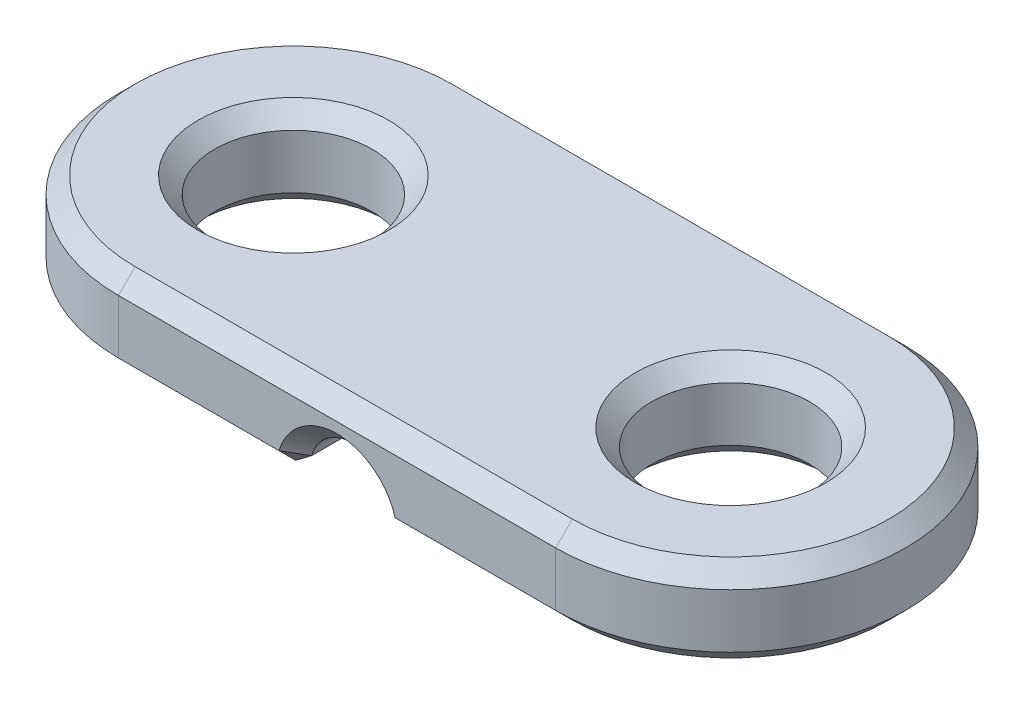
ISO-10303-21;
HEADER;
FILE_DESCRIPTION(('STEP AP214'),'2;1');
FILE_NAME('part.step','',(''),(''),'','','');
FILE_SCHEMA(('AUTOMOTIVE_DESIGN { 1 0 10303 214 1 1 1 1 }'));
ENDSEC;
DATA;
#1=APPLICATION_CONTEXT('core data for automotive mechanical design processes');
#2=APPLICATION_PROTOCOL_DEFINITION('international standard','automotive_design',2000,#1);
#3=PRODUCT_CONTEXT('',#1,'mechanical');
#4=PRODUCT('Part','Part','',(#3));
#5=PRODUCT_RELATED_PRODUCT_CATEGORY('part','',(#4));
#6=PRODUCT_DEFINITION_FORMATION('','',#4);
#7=PRODUCT_DEFINITION_CONTEXT('part definition',#1,'design');
#8=PRODUCT_DEFINITION('design','',#6,#7);
#9=PRODUCT_DEFINITION_SHAPE('','',#8);
#10=(LENGTH_UNIT() NAMED_UNIT(*) SI_UNIT(.MILLI.,.METRE.));
#11=(NAMED_UNIT(*) PLANE_ANGLE_UNIT() SI_UNIT($,.RADIAN.));
#12=(NAMED_UNIT(*) SI_UNIT($,.STERADIAN.) SOLID_ANGLE_UNIT());
#13=UNCERTAINTY_MEASURE_WITH_UNIT(LENGTH_MEASURE(1.E-05),#10,'distance_accuracy_value','');
#14=(GEOMETRIC_REPRESENTATION_CONTEXT(3) GLOBAL_UNCERTAINTY_ASSIGNED_CONTEXT((#13)) GLOBAL_UNIT_ASSIGNED_CONTEXT((#10,
#11,#12)) REPRESENTATION_CONTEXT('',''));
#15=CARTESIAN_POINT('',(0.,0.,0.));
#16=DIRECTION('',(0.,0.,1.));
#17=DIRECTION('',(1.,0.,0.));
#18=AXIS2_PLACEMENT_3D('',#15,#16,#17);
#19=CARTESIAN_POINT('',(-5.,0.,0.));
#20=DIRECTION('',(0.,1.,0.));
#21=DIRECTION('',(0.,0.,1.));
#22=AXIS2_PLACEMENT_3D('',#19,#20,#21);
#23=PLANE('',#22);
#24=CARTESIAN_POINT('',(-5.,0.,0.));
#25=DIRECTION('',(0.,1.,0.));
#26=DIRECTION('',(0.,0.,1.));
#27=AXIS2_PLACEMENT_3D('',#24,#25,#26);
#28=CIRCLE('',#27,2.181);
#29=CARTESIAN_POINT('',(-5.,0.,2.181));
#30=VERTEX_POINT('',#29);
#31=EDGE_CURVE('E194',#30,#30,#28,.T.);
#32=ORIENTED_EDGE('',*,*,#31,.T.);
#33=EDGE_LOOP('',(#32));
#34=FACE_BOUND('',#33,.T.);
#35=DIRECTION('',(-1.,0.,0.));
#36=VECTOR('',#35,1.);
#37=CARTESIAN_POINT('',(-5.,0.,3.619));
#38=LINE('',#37,#36);
#39=CARTESIAN_POINT('',(-1.32740348048361,0.,3.619));
#40=VERTEX_POINT('',#39);
#41=CARTESIAN_POINT('',(-5.,0.,3.619));
#42=VERTEX_POINT('',#41);
#43=EDGE_CURVE('E189',#40,#42,#38,.T.);
#44=ORIENTED_EDGE('',*,*,#43,.T.);
#45=CARTESIAN_POINT('',(-5.,0.,0.));
#46=DIRECTION('',(0.,1.,0.));
#47=DIRECTION('',(0.,0.,1.));
#48=AXIS2_PLACEMENT_3D('',#45,#46,#47);
#49=CIRCLE('',#48,3.619);
#50=CARTESIAN_POINT('',(-5.,0.,-3.619));
#51=VERTEX_POINT('',#50);
#52=EDGE_CURVE('E191',#42,#51,#49,.F.);
#53=ORIENTED_EDGE('',*,*,#52,.T.);
#54=DIRECTION('',(1.,0.,0.));
#55=VECTOR('',#54,1.);
#56=CARTESIAN_POINT('',(-5.,0.,-3.619));
#57=LINE('',#56,#55);
#58=CARTESIAN_POINT('',(-1.32740348048361,0.,-3.619));
#59=VERTEX_POINT('',#58);
#60=EDGE_CURVE('E187',#51,#59,#57,.T.);
#61=ORIENTED_EDGE('',*,*,#60,.T.);
#62=DIRECTION('',(0.,0.,1.));
#63=VECTOR('',#62,1.);
#64=CARTESIAN_POINT('',(-1.32740348048361,0.,0.));
#65=LINE('',#64,#63);
#66=EDGE_CURVE('E185',#59,#40,#65,.T.);
#67=ORIENTED_EDGE('',*,*,#66,.T.);
#68=EDGE_LOOP('',(#44,#53,#61,#67));
#69=FACE_BOUND('',#68,.T.);
#70=ADVANCED_FACE('F43',(#34,#69),#23,.F.);
#71=CARTESIAN_POINT('',(-5.,2.,0.));
#72=DIRECTION('',(0.,1.,0.));
#73=DIRECTION('',(0.,0.,1.));
#74=AXIS2_PLACEMENT_3D('',#71,#72,#73);
#75=PLANE('',#74);
#76=CARTESIAN_POINT('',(5.,2.,0.));
#77=DIRECTION('',(0.,1.,0.));
#78=DIRECTION('',(0.,0.,1.));
#79=AXIS2_PLACEMENT_3D('',#76,#77,#78);
#80=CIRCLE('',#79,2.181);
#81=CARTESIAN_POINT('',(5.,2.,2.181));
#82=VERTEX_POINT('',#81);
#83=EDGE_CURVE('E215',#82,#82,#80,.F.);
#84=ORIENTED_EDGE('',*,*,#83,.T.);
#85=EDGE_LOOP('',(#84));
#86=FACE_BOUND('',#85,.T.);
#87=CARTESIAN_POINT('',(5.,2.,0.));
#88=DIRECTION('',(0.,1.,0.));
#89=DIRECTION('',(0.,0.,1.));
#90=AXIS2_PLACEMENT_3D('',#87,#88,#89);
#91=CIRCLE('',#90,3.619);
#92=CARTESIAN_POINT('',(5.,2.,3.619));
#93=VERTEX_POINT('',#92);
#94=CARTESIAN_POINT('',(5.,2.,-3.619));
#95=VERTEX_POINT('',#94);
#96=EDGE_CURVE('E210',#93,#95,#91,.T.);
#97=ORIENTED_EDGE('',*,*,#96,.T.);
#98=DIRECTION('',(-1.,0.,0.));
#99=VECTOR('',#98,1.);
#100=CARTESIAN_POINT('',(-5.,2.,-3.619));
#101=LINE('',#100,#99);
#102=CARTESIAN_POINT('',(-5.,2.,-3.619));
#103=VERTEX_POINT('',#102);
#104=EDGE_CURVE('E212',#95,#103,#101,.T.);
#105=ORIENTED_EDGE('',*,*,#104,.T.);
#106=CARTESIAN_POINT('',(-5.,2.,0.));
#107=DIRECTION('',(0.,1.,0.));
#108=DIRECTION('',(0.,0.,1.));
#109=AXIS2_PLACEMENT_3D('',#106,#107,#108);
#110=CIRCLE('',#109,3.619);
#111=CARTESIAN_POINT('',(-5.,2.,3.619));
#112=VERTEX_POINT('',#111);
#113=EDGE_CURVE('E206',#103,#112,#110,.T.);
#114=ORIENTED_EDGE('',*,*,#113,.T.);
#115=DIRECTION('',(1.,0.,0.));
#116=VECTOR('',#115,1.);
#117=CARTESIAN_POINT('',(5.,2.,3.619));
#118=LINE('',#117,#116);
#119=EDGE_CURVE('E208',#112,#93,#118,.T.);
#120=ORIENTED_EDGE('',*,*,#119,.T.);
#121=EDGE_LOOP('',(#97,#105,#114,#120));
#122=FACE_BOUND('',#121,.T.);
#123=CARTESIAN_POINT('',(-5.,2.,0.));
#124=DIRECTION('',(0.,1.,0.));
#125=DIRECTION('',(0.,0.,1.));
#126=AXIS2_PLACEMENT_3D('',#123,#124,#125);
#127=CIRCLE('',#126,2.18100000000001);
#128=CARTESIAN_POINT('',(-5.,2.,2.18100000000001));
#129=VERTEX_POINT('',#128);
#130=EDGE_CURVE('E203',#129,#129,#127,.F.);
#131=ORIENTED_EDGE('',*,*,#130,.T.);
#132=EDGE_LOOP('',(#131));
#133=FACE_BOUND('',#132,.T.);
#134=ADVANCED_FACE('F369',(#86,#122,#133),#75,.T.);
#135=CARTESIAN_POINT('',(5.,0.,0.));
#136=DIRECTION('',(0.,1.,0.));
#137=DIRECTION('',(0.,0.,1.));
#138=AXIS2_PLACEMENT_3D('',#135,#136,#137);
#139=CIRCLE('',#138,2.181);
#140=CARTESIAN_POINT('',(5.,0.,-2.181));
#141=VERTEX_POINT('',#140);
#142=EDGE_CURVE('E172',#141,#141,#139,.T.);
#143=ORIENTED_EDGE('',*,*,#142,.T.);
#144=EDGE_LOOP('',(#143));
#145=FACE_BOUND('',#144,.T.);
#146=DIRECTION('',(1.,0.,0.));
#147=VECTOR('',#146,1.);
#148=CARTESIAN_POINT('',(-5.,0.,-3.619));
#149=LINE('',#148,#147);
#150=CARTESIAN_POINT('',(1.32740348048361,0.,-3.619));
#151=VERTEX_POINT('',#150);
#152=CARTESIAN_POINT('',(5.,0.,-3.619));
#153=VERTEX_POINT('',#152);
#154=EDGE_CURVE('E171',#151,#153,#149,.T.);
#155=ORIENTED_EDGE('',*,*,#154,.T.);
#156=CARTESIAN_POINT('',(5.,0.,0.));
#157=DIRECTION('',(0.,1.,0.));
#158=DIRECTION('',(0.,0.,1.));
#159=AXIS2_PLACEMENT_3D('',#156,#157,#158);
#160=CIRCLE('',#159,3.619);
#161=CARTESIAN_POINT('',(5.,0.,3.619));
#162=VERTEX_POINT('',#161);
#163=EDGE_CURVE('E150',#153,#162,#160,.F.);
#164=ORIENTED_EDGE('',*,*,#163,.T.);
#165=DIRECTION('',(-1.,0.,0.));
#166=VECTOR('',#165,1.);
#167=CARTESIAN_POINT('',(-5.,0.,3.619));
#168=LINE('',#167,#166);
#169=CARTESIAN_POINT('',(1.32740348048361,0.,3.619));
#170=VERTEX_POINT('',#169);
#171=EDGE_CURVE('E160',#162,#170,#168,.T.);
#172=ORIENTED_EDGE('',*,*,#171,.T.);
#173=DIRECTION('',(0.,0.,-1.));
#174=VECTOR('',#173,1.);
#175=CARTESIAN_POINT('',(1.32740348048361,0.,0.));
#176=LINE('',#175,#174);
#177=EDGE_CURVE('E166',#170,#151,#176,.T.);
#178=ORIENTED_EDGE('',*,*,#177,.T.);
#179=EDGE_LOOP('',(#155,#164,#172,#178));
#180=FACE_BOUND('',#179,.T.);
#181=ADVANCED_FACE('F169',(#145,#180),#23,.F.);
#182=CARTESIAN_POINT('',(-5.,2.,0.));
#183=DIRECTION('',(0.,-1.,0.));
#184=DIRECTION('',(0.,0.,-1.));
#185=AXIS2_PLACEMENT_3D('',#182,#183,#184);
#186=CYLINDRICAL_SURFACE('',#185,4.);
#187=DIRECTION('',(0.,-1.,0.));
#188=VECTOR('',#187,1.);
#189=CARTESIAN_POINT('',(-5.,2.,4.));
#190=LINE('',#189,#188);
#191=CARTESIAN_POINT('',(-5.,1.619,4.));
#192=VERTEX_POINT('',#191);
#193=CARTESIAN_POINT('',(-5.,0.381000000000002,4.));
#194=VERTEX_POINT('',#193);
#195=EDGE_CURVE('E167',#192,#194,#190,.T.);
#196=ORIENTED_EDGE('',*,*,#195,.F.);
#197=CARTESIAN_POINT('',(-5.,1.619,0.));
#198=DIRECTION('',(0.,1.,0.));
#199=DIRECTION('',(0.,0.,1.));
#200=AXIS2_PLACEMENT_3D('',#197,#198,#199);
#201=CIRCLE('',#200,4.);
#202=CARTESIAN_POINT('',(-5.,1.619,-4.));
#203=VERTEX_POINT('',#202);
#204=EDGE_CURVE('E240',#192,#203,#201,.F.);
#205=ORIENTED_EDGE('',*,*,#204,.T.);
#206=DIRECTION('',(0.,-1.,0.));
#207=VECTOR('',#206,1.);
#208=CARTESIAN_POINT('',(-5.,2.,-4.));
#209=LINE('',#208,#207);
#210=CARTESIAN_POINT('',(-5.,0.380999999999999,-4.));
#211=VERTEX_POINT('',#210);
#212=EDGE_CURVE('E256',#203,#211,#209,.T.);
#213=ORIENTED_EDGE('',*,*,#212,.T.);
#214=CARTESIAN_POINT('',(-5.,0.380999999999999,0.));
#215=DIRECTION('',(0.,1.,0.));
#216=DIRECTION('',(0.,0.,1.));
#217=AXIS2_PLACEMENT_3D('',#214,#215,#216);
#218=CIRCLE('',#217,4.);
#219=EDGE_CURVE('E238',#211,#194,#218,.T.);
#220=ORIENTED_EDGE('',*,*,#219,.T.);
#221=EDGE_LOOP('',(#196,#205,#213,#220));
#222=FACE_BOUND('',#221,.T.);
#223=ADVANCED_FACE('F352',(#222),#186,.T.);
#224=CARTESIAN_POINT('',(-5.,2.,4.));
#225=DIRECTION('',(0.,0.,-1.));
#226=DIRECTION('',(-1.,0.,0.));
#227=AXIS2_PLACEMENT_3D('',#224,#225,#226);
#228=PLANE('',#227);
#229=DIRECTION('',(0.,-1.,0.));
#230=VECTOR('',#229,1.);
#231=CARTESIAN_POINT('',(5.,2.,4.));
#232=LINE('',#231,#230);
#233=CARTESIAN_POINT('',(5.,1.619,4.));
#234=VERTEX_POINT('',#233);
#235=CARTESIAN_POINT('',(5.,0.381000000000002,4.));
#236=VERTEX_POINT('',#235);
#237=EDGE_CURVE('E343',#234,#236,#232,.T.);
#238=ORIENTED_EDGE('',*,*,#237,.F.);
#239=DIRECTION('',(-1.,0.,0.));
#240=VECTOR('',#239,1.);
#241=CARTESIAN_POINT('',(-5.,1.619,4.));
#242=LINE('',#241,#240);
#243=EDGE_CURVE('E236',#234,#192,#242,.T.);
#244=ORIENTED_EDGE('',*,*,#243,.T.);
#245=ORIENTED_EDGE('',*,*,#195,.T.);
#246=DIRECTION('',(1.,0.,0.));
#247=VECTOR('',#246,1.);
#248=CARTESIAN_POINT('',(-5.,0.381000000000002,4.));
#249=LINE('',#248,#247);
#250=CARTESIAN_POINT('',(-1.32740348048361,0.381000000000002,4.));
#251=VERTEX_POINT('',#250);
#252=EDGE_CURVE('E232',#194,#251,#249,.T.);
#253=ORIENTED_EDGE('',*,*,#252,.T.);
#254=CARTESIAN_POINT('',(0.,0.,4.));
#255=DIRECTION('',(0.,0.,-1.));
#256=DIRECTION('',(-1.,0.,0.));
#257=AXIS2_PLACEMENT_3D('',#254,#255,#256);
#258=CIRCLE('',#257,1.381);
#259=CARTESIAN_POINT('',(1.32740348048361,0.381000000000002,4.));
#260=VERTEX_POINT('',#259);
#261=EDGE_CURVE('E230',#251,#260,#258,.T.);
#262=ORIENTED_EDGE('',*,*,#261,.T.);
#263=DIRECTION('',(1.,0.,0.));
#264=VECTOR('',#263,1.);
#265=CARTESIAN_POINT('',(-5.,0.381000000000002,4.));
#266=LINE('',#265,#264);
#267=EDGE_CURVE('E234',#260,#236,#266,.T.);
#268=ORIENTED_EDGE('',*,*,#267,.T.);
#269=EDGE_LOOP('',(#238,#244,#245,#253,#262,#268));
#270=FACE_BOUND('',#269,.T.);
#271=ADVANCED_FACE('F336',(#270),#228,.F.);
#272=CARTESIAN_POINT('',(5.,2.,0.));
#273=DIRECTION('',(0.,-1.,0.));
#274=DIRECTION('',(0.,0.,-1.));
#275=AXIS2_PLACEMENT_3D('',#272,#273,#274);
#276=CYLINDRICAL_SURFACE('',#275,4.);
#277=DIRECTION('',(0.,-1.,0.));
#278=VECTOR('',#277,1.);
#279=CARTESIAN_POINT('',(5.,2.,-4.));
#280=LINE('',#279,#278);
#281=CARTESIAN_POINT('',(5.,1.619,-4.));
#282=VERTEX_POINT('',#281);
#283=CARTESIAN_POINT('',(5.,0.380999999999999,-4.));
#284=VERTEX_POINT('',#283);
#285=EDGE_CURVE('E345',#282,#284,#280,.T.);
#286=ORIENTED_EDGE('',*,*,#285,.F.);
#287=CARTESIAN_POINT('',(5.,1.619,0.));
#288=DIRECTION('',(0.,1.,0.));
#289=DIRECTION('',(0.,0.,1.));
#290=AXIS2_PLACEMENT_3D('',#287,#288,#289);
#291=CIRCLE('',#290,4.);
#292=EDGE_CURVE('E228',#282,#234,#291,.F.);
#293=ORIENTED_EDGE('',*,*,#292,.T.);
#294=ORIENTED_EDGE('',*,*,#237,.T.);
#295=CARTESIAN_POINT('',(5.,0.380999999999999,0.));
#296=DIRECTION('',(0.,1.,0.));
#297=DIRECTION('',(0.,0.,1.));
#298=AXIS2_PLACEMENT_3D('',#295,#296,#297);
#299=CIRCLE('',#298,4.);
#300=EDGE_CURVE('E153',#236,#284,#299,.T.);
#301=ORIENTED_EDGE('',*,*,#300,.T.);
#302=EDGE_LOOP('',(#286,#293,#294,#301));
#303=FACE_BOUND('',#302,.T.);
#304=ADVANCED_FACE('F376',(#303),#276,.T.);
#305=CARTESIAN_POINT('',(-5.,2.,-4.));
#306=DIRECTION('',(0.,0.,1.));
#307=DIRECTION('',(1.,0.,0.));
#308=AXIS2_PLACEMENT_3D('',#305,#306,#307);
#309=PLANE('',#308);
#310=ORIENTED_EDGE('',*,*,#212,.F.);
#311=DIRECTION('',(1.,0.,0.));
#312=VECTOR('',#311,1.);
#313=CARTESIAN_POINT('',(5.,1.619,-4.));
#314=LINE('',#313,#312);
#315=EDGE_CURVE('E224',#203,#282,#314,.T.);
#316=ORIENTED_EDGE('',*,*,#315,.T.);
#317=ORIENTED_EDGE('',*,*,#285,.T.);
#318=DIRECTION('',(-1.,0.,0.));
#319=VECTOR('',#318,1.);
#320=CARTESIAN_POINT('',(-5.,0.380999999999999,-4.));
#321=LINE('',#320,#319);
#322=CARTESIAN_POINT('',(1.32740348048361,0.380999999999999,-4.));
#323=VERTEX_POINT('',#322);
#324=EDGE_CURVE('E222',#284,#323,#321,.T.);
#325=ORIENTED_EDGE('',*,*,#324,.T.);
#326=CARTESIAN_POINT('',(0.,0.,-4.));
#327=DIRECTION('',(0.,0.,1.));
#328=DIRECTION('',(1.,0.,0.));
#329=AXIS2_PLACEMENT_3D('',#326,#327,#328);
#330=CIRCLE('',#329,1.381);
#331=CARTESIAN_POINT('',(-1.32740348048361,0.380999999999999,-4.));
#332=VERTEX_POINT('',#331);
#333=EDGE_CURVE('E218',#323,#332,#330,.T.);
#334=ORIENTED_EDGE('',*,*,#333,.T.);
#335=DIRECTION('',(-1.,0.,0.));
#336=VECTOR('',#335,1.);
#337=CARTESIAN_POINT('',(-5.,0.380999999999999,-4.));
#338=LINE('',#337,#336);
#339=EDGE_CURVE('E220',#332,#211,#338,.T.);
#340=ORIENTED_EDGE('',*,*,#339,.T.);
#341=EDGE_LOOP('',(#310,#316,#317,#325,#334,#340));
#342=FACE_BOUND('',#341,.T.);
#343=ADVANCED_FACE('F356',(#342),#309,.F.);
#344=CARTESIAN_POINT('',(-5.,2.,0.));
#345=DIRECTION('',(0.,-1.,0.));
#346=DIRECTION('',(0.,0.,-1.));
#347=AXIS2_PLACEMENT_3D('',#344,#345,#346);
#348=CYLINDRICAL_SURFACE('',#347,1.8);
#349=CARTESIAN_POINT('',(-5.,0.381,0.));
#350=DIRECTION('',(0.,1.,0.));
#351=DIRECTION('',(0.,0.,1.));
#352=AXIS2_PLACEMENT_3D('',#349,#350,#351);
#353=CIRCLE('',#352,1.8);
#354=CARTESIAN_POINT('',(-5.,0.381,1.8));
#355=VERTEX_POINT('',#354);
#356=EDGE_CURVE('E200',#355,#355,#353,.F.);
#357=ORIENTED_EDGE('',*,*,#356,.T.);
#358=EDGE_LOOP('',(#357));
#359=FACE_BOUND('',#358,.T.);
#360=CARTESIAN_POINT('',(-5.,1.619,0.));
#361=DIRECTION('',(0.,1.,0.));
#362=DIRECTION('',(0.,0.,1.));
#363=AXIS2_PLACEMENT_3D('',#360,#361,#362);
#364=CIRCLE('',#363,1.8);
#365=CARTESIAN_POINT('',(-5.,1.619,1.8));
#366=VERTEX_POINT('',#365);
#367=EDGE_CURVE('E197',#366,#366,#364,.T.);
#368=ORIENTED_EDGE('',*,*,#367,.T.);
#369=EDGE_LOOP('',(#368));
#370=FACE_BOUND('',#369,.T.);
#371=ADVANCED_FACE('F621',(#359,#370),#348,.F.);
#372=CARTESIAN_POINT('',(5.,2.,0.));
#373=DIRECTION('',(0.,-1.,0.));
#374=DIRECTION('',(0.,0.,-1.));
#375=AXIS2_PLACEMENT_3D('',#372,#373,#374);
#376=CYLINDRICAL_SURFACE('',#375,1.8);
#377=CARTESIAN_POINT('',(5.,0.381,0.));
#378=DIRECTION('',(0.,1.,0.));
#379=DIRECTION('',(0.,0.,1.));
#380=AXIS2_PLACEMENT_3D('',#377,#378,#379);
#381=CIRCLE('',#380,1.8);
#382=CARTESIAN_POINT('',(5.,0.381,-1.8));
#383=VERTEX_POINT('',#382);
#384=EDGE_CURVE('E182',#383,#383,#381,.F.);
#385=ORIENTED_EDGE('',*,*,#384,.T.);
#386=EDGE_LOOP('',(#385));
#387=FACE_BOUND('',#386,.T.);
#388=CARTESIAN_POINT('',(5.,1.619,0.));
#389=DIRECTION('',(0.,1.,0.));
#390=DIRECTION('',(0.,0.,1.));
#391=AXIS2_PLACEMENT_3D('',#388,#389,#390);
#392=CIRCLE('',#391,1.8);
#393=CARTESIAN_POINT('',(5.,1.619,1.8));
#394=VERTEX_POINT('',#393);
#395=EDGE_CURVE('E175',#394,#394,#392,.T.);
#396=ORIENTED_EDGE('',*,*,#395,.T.);
#397=EDGE_LOOP('',(#396));
#398=FACE_BOUND('',#397,.T.);
#399=ADVANCED_FACE('F419',(#387,#398),#376,.F.);
#400=CARTESIAN_POINT('',(0.,0.,-4.00000000000001));
#401=DIRECTION('',(0.,0.,1.));
#402=DIRECTION('',(1.,0.,0.));
#403=AXIS2_PLACEMENT_3D('',#400,#401,#402);
#404=CYLINDRICAL_SURFACE('',#403,1.);
#405=CARTESIAN_POINT('',(0.,0.,-3.619));
#406=DIRECTION('',(0.,0.,1.));
#407=DIRECTION('',(1.,0.,0.));
#408=AXIS2_PLACEMENT_3D('',#405,#406,#407);
#409=CIRCLE('',#408,1.);
#410=CARTESIAN_POINT('',(-0.961190065520354,0.275887038377985,-3.619));
#411=VERTEX_POINT('',#410);
#412=CARTESIAN_POINT('',(0.961190065520356,0.275887038377985,-3.619));
#413=VERTEX_POINT('',#412);
#414=EDGE_CURVE('E53',#411,#413,#409,.F.);
#415=ORIENTED_EDGE('',*,*,#414,.T.);
#416=DIRECTION('',(0.,0.,1.));
#417=VECTOR('',#416,1.);
#418=CARTESIAN_POINT('',(0.961190065520355,0.275887038377986,-4.00000000000001));
#419=LINE('',#418,#417);
#420=CARTESIAN_POINT('',(0.961190065520356,0.275887038377985,3.619));
#421=VERTEX_POINT('',#420);
#422=EDGE_CURVE('E11',#413,#421,#419,.T.);
#423=ORIENTED_EDGE('',*,*,#422,.T.);
#424=CARTESIAN_POINT('',(0.,0.,3.619));
#425=DIRECTION('',(0.,0.,-1.));
#426=DIRECTION('',(-1.,0.,0.));
#427=AXIS2_PLACEMENT_3D('',#424,#425,#426);
#428=CIRCLE('',#427,1.);
#429=CARTESIAN_POINT('',(-0.961190065520354,0.275887038377985,3.619));
#430=VERTEX_POINT('',#429);
#431=EDGE_CURVE('E242',#421,#430,#428,.F.);
#432=ORIENTED_EDGE('',*,*,#431,.T.);
#433=DIRECTION('',(0.,0.,1.));
#434=VECTOR('',#433,1.);
#435=CARTESIAN_POINT('',(-0.961190065520354,0.275887038377986,-4.00000000000001));
#436=LINE('',#435,#434);
#437=EDGE_CURVE('E64',#430,#411,#436,.F.);
#438=ORIENTED_EDGE('',*,*,#437,.T.);
#439=EDGE_LOOP('',(#415,#423,#432,#438));
#440=FACE_BOUND('',#439,.T.);
#441=ADVANCED_FACE('F326',(#440),#404,.F.);
#442=CARTESIAN_POINT('',(5.,0.,0.));
#443=DIRECTION('',(0.,-1.,0.));
#444=DIRECTION('',(0.,0.,-1.));
#445=AXIS2_PLACEMENT_3D('',#442,#443,#444);
#446=CONICAL_SURFACE('',#445,2.181,0.785398163397448);
#447=CARTESIAN_POINT('',(5.,0.381,-1.8));
#448=CARTESIAN_POINT('',(5.,0.37703125,-1.80396875));
#449=CARTESIAN_POINT('',(5.,0.3730625,-1.8079375));
#450=CARTESIAN_POINT('',(5.,0.365125,-1.815875));
#451=CARTESIAN_POINT('',(5.,0.36115625,-1.81984375));
#452=CARTESIAN_POINT('',(5.,0.35321875,-1.82778125));
#453=CARTESIAN_POINT('',(5.,0.34925,-1.83175));
#454=CARTESIAN_POINT('',(5.,0.3413125,-1.8396875));
#455=CARTESIAN_POINT('',(5.,0.33734375,-1.84365625));
#456=CARTESIAN_POINT('',(5.,0.32940625,-1.85159375));
#457=CARTESIAN_POINT('',(5.,0.3254375,-1.8555625));
#458=CARTESIAN_POINT('',(5.,0.3175,-1.8635));
#459=CARTESIAN_POINT('',(5.,0.31353125,-1.86746875));
#460=CARTESIAN_POINT('',(5.,0.30559375,-1.87540625));
#461=CARTESIAN_POINT('',(5.,0.301625,-1.879375));
#462=CARTESIAN_POINT('',(5.,0.2936875,-1.8873125));
#463=CARTESIAN_POINT('',(5.,0.28971875,-1.89128125));
#464=CARTESIAN_POINT('',(5.,0.28178125,-1.89921875));
#465=CARTESIAN_POINT('',(5.,0.2778125,-1.9031875));
#466=CARTESIAN_POINT('',(5.,0.269875,-1.911125));
#467=CARTESIAN_POINT('',(5.,0.26590625,-1.91509375));
#468=CARTESIAN_POINT('',(5.,0.25796875,-1.92303125));
#469=CARTESIAN_POINT('',(5.,0.254,-1.927));
#470=CARTESIAN_POINT('',(5.,0.2460625,-1.9349375));
#471=CARTESIAN_POINT('',(5.,0.24209375,-1.93890625));
#472=CARTESIAN_POINT('',(5.,0.23415625,-1.94684375));
#473=CARTESIAN_POINT('',(5.,0.2301875,-1.9508125));
#474=CARTESIAN_POINT('',(5.,0.22225,-1.95875));
#475=CARTESIAN_POINT('',(5.,0.21828125,-1.96271875));
#476=CARTESIAN_POINT('',(5.,0.21034375,-1.97065625));
#477=CARTESIAN_POINT('',(5.,0.206375,-1.974625));
#478=CARTESIAN_POINT('',(5.,0.1984375,-1.9825625));
#479=CARTESIAN_POINT('',(5.,0.19446875,-1.98653125));
#480=CARTESIAN_POINT('',(5.,0.18653125,-1.99446875));
#481=CARTESIAN_POINT('',(5.,0.1825625,-1.9984375));
#482=CARTESIAN_POINT('',(5.,0.174625,-2.006375));
#483=CARTESIAN_POINT('',(5.,0.17065625,-2.01034375));
#484=CARTESIAN_POINT('',(5.,0.16271875,-2.01828125));
#485=CARTESIAN_POINT('',(5.,0.15875,-2.02225));
#486=CARTESIAN_POINT('',(5.,0.1508125,-2.0301875));
#487=CARTESIAN_POINT('',(5.,0.14684375,-2.03415625));
#488=CARTESIAN_POINT('',(5.,0.13890625,-2.04209375));
#489=CARTESIAN_POINT('',(5.,0.1349375,-2.0460625));
#490=CARTESIAN_POINT('',(5.,0.127,-2.054));
#491=CARTESIAN_POINT('',(5.,0.12303125,-2.05796875));
#492=CARTESIAN_POINT('',(5.,0.11509375,-2.06590625));
#493=CARTESIAN_POINT('',(5.,0.111125,-2.069875));
#494=CARTESIAN_POINT('',(5.,0.1031875,-2.0778125));
#495=CARTESIAN_POINT('',(5.,0.0992187500000001,-2.08178125));
#496=CARTESIAN_POINT('',(5.,0.0912812500000001,-2.08971875));
#497=CARTESIAN_POINT('',(5.,0.0873125,-2.0936875));
#498=CARTESIAN_POINT('',(5.,0.079375,-2.101625));
#499=CARTESIAN_POINT('',(5.,0.0754062500000001,-2.10559375));
#500=CARTESIAN_POINT('',(5.,0.0674687500000001,-2.11353125));
#501=CARTESIAN_POINT('',(5.,0.0635,-2.1175));
#502=CARTESIAN_POINT('',(5.,0.0555625,-2.1254375));
#503=CARTESIAN_POINT('',(5.,0.05159375,-2.12940625));
#504=CARTESIAN_POINT('',(5.,0.0436562500000001,-2.13734375));
#505=CARTESIAN_POINT('',(5.,0.0396875,-2.1413125));
#506=CARTESIAN_POINT('',(5.,0.03175,-2.14925));
#507=CARTESIAN_POINT('',(5.,0.02778125,-2.15321875));
#508=CARTESIAN_POINT('',(5.,0.01984375,-2.16115625));
#509=CARTESIAN_POINT('',(5.,0.015875,-2.165125));
#510=CARTESIAN_POINT('',(5.,0.00793750000000002,-2.1730625));
#511=CARTESIAN_POINT('',(5.,0.00396875000000003,-2.17703125));
#512=CARTESIAN_POINT('',(5.,0.,-2.181));
#513=B_SPLINE_CURVE_WITH_KNOTS('',3,(#447,#448,#449,#450,#451,#452,#453,#454,#455,#456,#457,
#458,#459,#460,#461,#462,#463,#464,#465,#466,#467,#468,#469,#470,#471,#472,#473,#474,#475,#476,
#477,#478,#479,#480,#481,#482,#483,#484,#485,#486,#487,#488,#489,#490,#491,#492,#493,#494,#495,
#496,#497,#498,#499,#500,#501,#502,#503,#504,#505,#506,#507,#508,#509,#510,#511,#512),
.UNSPECIFIED.,.F.,.F.,(4,2,2,2,2,2,2,2,2,2,2,2,2,2,2,2,2,2,2,2,2,2,2,2,2,2,2,2,2,2,2,2,4),(0.,
0.0168379802270046,0.0336759604540093,0.050513940681014,0.0673519209080186,0.0841899011350233,
0.101027881362028,0.117865861589033,0.134703841816037,0.151541822043042,0.168379802270047,
0.185217782497051,0.202055762724056,0.218893742951061,0.235731723178065,0.25256970340507,
0.269407683632075,0.28624566385908,0.303083644086084,0.319921624313089,0.336759604540093,
0.353597584767098,0.370435564994103,0.387273545221107,0.404111525448112,0.420949505675117,
0.437787485902122,0.454625466129126,0.471463446356131,0.488301426583135,0.50513940681014,
0.521977387037145,0.53881536726415),.UNSPECIFIED.);
#514=EDGE_CURVE('BSEAM409',#383,#141,#513,.T.);
#515=ORIENTED_EDGE('',*,*,#384,.F.);
#516=ORIENTED_EDGE('',*,*,#142,.F.);
#517=ORIENTED_EDGE('',*,*,#514,.T.);
#518=ORIENTED_EDGE('',*,*,#514,.F.);
#519=EDGE_LOOP('',(#515,#517,#516,#518));
#520=FACE_BOUND('',#519,.T.);
#521=ADVANCED_FACE('F409',(#520),#446,.F.);
#522=CARTESIAN_POINT('',(-5.,0.,0.));
#523=DIRECTION('',(0.,-1.,0.));
#524=DIRECTION('',(0.,0.,-1.));
#525=AXIS2_PLACEMENT_3D('',#522,#523,#524);
#526=CONICAL_SURFACE('',#525,2.181,0.785398163397445);
#527=ORIENTED_EDGE('',*,*,#356,.F.);
#528=EDGE_LOOP('',(#527));
#529=FACE_BOUND('',#528,.T.);
#530=ORIENTED_EDGE('',*,*,#31,.F.);
#531=EDGE_LOOP('',(#530));
#532=FACE_BOUND('',#531,.T.);
#533=ADVANCED_FACE('F387',(#529,#532),#526,.F.);
#534=CARTESIAN_POINT('',(5.,1.619,0.));
#535=DIRECTION('',(0.,1.,0.));
#536=DIRECTION('',(0.,0.,1.));
#537=AXIS2_PLACEMENT_3D('',#534,#535,#536);
#538=CONICAL_SURFACE('',#537,1.8,0.785398163397446);
#539=ORIENTED_EDGE('',*,*,#83,.F.);
#540=EDGE_LOOP('',(#539));
#541=FACE_BOUND('',#540,.T.);
#542=ORIENTED_EDGE('',*,*,#395,.F.);
#543=EDGE_LOOP('',(#542));
#544=FACE_BOUND('',#543,.T.);
#545=ADVANCED_FACE('F380',(#541,#544),#538,.F.);
#546=CARTESIAN_POINT('',(-5.,2.,3.619));
#547=DIRECTION('',(0.,0.707106781186545,0.70710678118655));
#548=DIRECTION('',(-1.,0.,0.));
#549=AXIS2_PLACEMENT_3D('',#546,#547,#548);
#550=PLANE('',#549);
#551=DIRECTION('',(0.,0.70710678118655,-0.707106781186545));
#552=VECTOR('',#551,1.);
#553=CARTESIAN_POINT('',(-5.,1.619,4.));
#554=LINE('',#553,#552);
#555=EDGE_CURVE('E250',#192,#112,#554,.T.);
#556=ORIENTED_EDGE('',*,*,#555,.F.);
#557=ORIENTED_EDGE('',*,*,#243,.F.);
#558=DIRECTION('',(0.,-0.70710678118655,0.707106781186545));
#559=VECTOR('',#558,1.);
#560=CARTESIAN_POINT('',(5.,2.,3.619));
#561=LINE('',#560,#559);
#562=EDGE_CURVE('E253',#93,#234,#561,.T.);
#563=ORIENTED_EDGE('',*,*,#562,.F.);
#564=ORIENTED_EDGE('',*,*,#119,.F.);
#565=EDGE_LOOP('',(#556,#557,#563,#564));
#566=FACE_BOUND('',#565,.T.);
#567=ADVANCED_FACE('F378',(#566),#550,.T.);
#568=CARTESIAN_POINT('',(5.,2.,0.));
#569=DIRECTION('',(0.,-1.,0.));
#570=DIRECTION('',(0.,0.,-1.));
#571=AXIS2_PLACEMENT_3D('',#568,#569,#570);
#572=CONICAL_SURFACE('',#571,3.619,0.785398163397445);
#573=ORIENTED_EDGE('',*,*,#562,.T.);
#574=ORIENTED_EDGE('',*,*,#292,.F.);
#575=DIRECTION('',(0.,-0.70710678118655,-0.707106781186545));
#576=VECTOR('',#575,1.);
#577=CARTESIAN_POINT('',(5.,2.,-3.619));
#578=LINE('',#577,#576);
#579=EDGE_CURVE('E248',#95,#282,#578,.T.);
#580=ORIENTED_EDGE('',*,*,#579,.F.);
#581=ORIENTED_EDGE('',*,*,#96,.F.);
#582=EDGE_LOOP('',(#573,#574,#580,#581));
#583=FACE_BOUND('',#582,.T.);
#584=ADVANCED_FACE('F374',(#583),#572,.T.);
#585=CARTESIAN_POINT('',(-5.,2.,0.));
#586=DIRECTION('',(0.,-1.,0.));
#587=DIRECTION('',(0.,0.,-1.));
#588=AXIS2_PLACEMENT_3D('',#585,#586,#587);
#589=CONICAL_SURFACE('',#588,3.619,0.785398163397445);
#590=ORIENTED_EDGE('',*,*,#555,.T.);
#591=ORIENTED_EDGE('',*,*,#113,.F.);
#592=DIRECTION('',(0.,0.70710678118655,0.707106781186545));
#593=VECTOR('',#592,1.);
#594=CARTESIAN_POINT('',(-5.,1.619,-4.));
#595=LINE('',#594,#593);
#596=EDGE_CURVE('E246',#203,#103,#595,.T.);
#597=ORIENTED_EDGE('',*,*,#596,.F.);
#598=ORIENTED_EDGE('',*,*,#204,.F.);
#599=EDGE_LOOP('',(#590,#591,#597,#598));
#600=FACE_BOUND('',#599,.T.);
#601=ADVANCED_FACE('F366',(#600),#589,.T.);
#602=CARTESIAN_POINT('',(-5.,2.,-3.619));
#603=DIRECTION('',(0.,0.707106781186545,-0.70710678118655));
#604=DIRECTION('',(1.,0.,0.));
#605=AXIS2_PLACEMENT_3D('',#602,#603,#604);
#606=PLANE('',#605);
#607=ORIENTED_EDGE('',*,*,#579,.T.);
#608=ORIENTED_EDGE('',*,*,#315,.F.);
#609=ORIENTED_EDGE('',*,*,#596,.T.);
#610=ORIENTED_EDGE('',*,*,#104,.F.);
#611=EDGE_LOOP('',(#607,#608,#609,#610));
#612=FACE_BOUND('',#611,.T.);
#613=ADVANCED_FACE('F360',(#612),#606,.T.);
#614=CARTESIAN_POINT('',(-5.,1.619,0.));
#615=DIRECTION('',(0.,1.,0.));
#616=DIRECTION('',(0.,0.,1.));
#617=AXIS2_PLACEMENT_3D('',#614,#615,#616);
#618=CONICAL_SURFACE('',#617,1.8,0.785398163397452);
#619=ORIENTED_EDGE('',*,*,#130,.F.);
#620=EDGE_LOOP('',(#619));
#621=FACE_BOUND('',#620,.T.);
#622=ORIENTED_EDGE('',*,*,#367,.F.);
#623=EDGE_LOOP('',(#622));
#624=FACE_BOUND('',#623,.T.);
#625=ADVANCED_FACE('F440',(#621,#624),#618,.F.);
#626=CARTESIAN_POINT('',(-5.,0.380999999999999,0.));
#627=DIRECTION('',(0.,1.,0.));
#628=DIRECTION('',(0.,0.,1.));
#629=AXIS2_PLACEMENT_3D('',#626,#627,#628);
#630=CONICAL_SURFACE('',#629,4.,0.785398163397452);
#631=DIRECTION('',(0.,0.707106781186545,-0.70710678118655));
#632=VECTOR('',#631,1.);
#633=CARTESIAN_POINT('',(-5.,0.,-3.619));
#634=LINE('',#633,#632);
#635=EDGE_CURVE('E289',#51,#211,#634,.T.);
#636=ORIENTED_EDGE('',*,*,#635,.F.);
#637=ORIENTED_EDGE('',*,*,#52,.F.);
#638=DIRECTION('',(0.,-0.707106781186545,-0.70710678118655));
#639=VECTOR('',#638,1.);
#640=CARTESIAN_POINT('',(-5.,0.380999999999999,4.));
#641=LINE('',#640,#639);
#642=EDGE_CURVE('E48',#194,#42,#641,.T.);
#643=ORIENTED_EDGE('',*,*,#642,.F.);
#644=ORIENTED_EDGE('',*,*,#219,.F.);
#645=EDGE_LOOP('',(#636,#637,#643,#644));
#646=FACE_BOUND('',#645,.T.);
#647=ADVANCED_FACE('F46',(#646),#630,.T.);
#648=CARTESIAN_POINT('',(-5.,0.381000000000002,4.));
#649=DIRECTION('',(0.,0.707106781186545,-0.70710678118655));
#650=DIRECTION('',(1.,0.,0.));
#651=AXIS2_PLACEMENT_3D('',#648,#649,#650);
#652=PLANE('',#651);
#653=ORIENTED_EDGE('',*,*,#642,.T.);
#654=ORIENTED_EDGE('',*,*,#43,.F.);
#655=DIRECTION('',(0.,0.70710678118655,0.707106781186545));
#656=VECTOR('',#655,1.);
#657=CARTESIAN_POINT('',(-1.32740348048361,0.381000000000002,4.));
#658=LINE('',#657,#656);
#659=EDGE_CURVE('E284',#251,#40,#658,.F.);
#660=ORIENTED_EDGE('',*,*,#659,.F.);
#661=ORIENTED_EDGE('',*,*,#252,.F.);
#662=EDGE_LOOP('',(#653,#654,#660,#661));
#663=FACE_BOUND('',#662,.T.);
#664=ADVANCED_FACE('F299',(#663),#652,.F.);
#665=CARTESIAN_POINT('',(-5.,0.380999999999999,-4.));
#666=DIRECTION('',(0.,0.70710678118655,0.707106781186545));
#667=DIRECTION('',(-1.,0.,0.));
#668=AXIS2_PLACEMENT_3D('',#665,#666,#667);
#669=PLANE('',#668);
#670=ORIENTED_EDGE('',*,*,#635,.T.);
#671=ORIENTED_EDGE('',*,*,#339,.F.);
#672=DIRECTION('',(0.,-0.707106781186545,0.70710678118655));
#673=VECTOR('',#672,1.);
#674=CARTESIAN_POINT('',(-1.32740348048361,0.,-3.619));
#675=LINE('',#674,#673);
#676=EDGE_CURVE('E281',#59,#332,#675,.F.);
#677=ORIENTED_EDGE('',*,*,#676,.F.);
#678=ORIENTED_EDGE('',*,*,#60,.F.);
#679=EDGE_LOOP('',(#670,#671,#677,#678));
#680=FACE_BOUND('',#679,.T.);
#681=ADVANCED_FACE('F311',(#680),#669,.F.);
#682=CARTESIAN_POINT('',(-1.32740348048361,0.,-4.00000000000001));
#683=DIRECTION('',(-0.601711293571096,0.798713665332576,0.));
#684=DIRECTION('',(0.,0.,1.));
#685=AXIS2_PLACEMENT_3D('',#682,#683,#684);
#686=PLANE('',#685);
#687=DIRECTION('',(-0.798713665332576,-0.601711293571096,0.));
#688=VECTOR('',#687,1.);
#689=CARTESIAN_POINT('',(-1.14429677300198,0.137943519188993,3.619));
#690=LINE('',#689,#688);
#691=EDGE_CURVE('E287',#40,#430,#690,.F.);
#692=ORIENTED_EDGE('',*,*,#691,.F.);
#693=ORIENTED_EDGE('',*,*,#66,.F.);
#694=DIRECTION('',(0.798713665332576,0.601711293571096,0.));
#695=VECTOR('',#694,1.);
#696=CARTESIAN_POINT('',(-1.32740348048361,0.,-3.619));
#697=LINE('',#696,#695);
#698=EDGE_CURVE('E278',#411,#59,#697,.F.);
#699=ORIENTED_EDGE('',*,*,#698,.F.);
#700=ORIENTED_EDGE('',*,*,#437,.F.);
#701=EDGE_LOOP('',(#692,#693,#699,#700));
#702=FACE_BOUND('',#701,.T.);
#703=ADVANCED_FACE('F309',(#702),#686,.F.);
#704=CARTESIAN_POINT('',(-1.32740348048361,0.381000000000002,4.));
#705=DIRECTION('',(0.470152448139532,-0.624081996018311,0.624081996018315));
#706=DIRECTION('',(0.,-0.70710678118655,-0.707106781186545));
#707=AXIS2_PLACEMENT_3D('',#704,#705,#706);
#708=PLANE('',#707);
#709=ORIENTED_EDGE('',*,*,#659,.T.);
#710=ORIENTED_EDGE('',*,*,#691,.T.);
#711=DIRECTION('',(0.679664013338586,-0.195081595678554,-0.707106781186544));
#712=VECTOR('',#711,1.);
#713=CARTESIAN_POINT('',(0.,0.,2.61900000000001));
#714=LINE('',#713,#712);
#715=EDGE_CURVE('E275',#251,#430,#714,.T.);
#716=ORIENTED_EDGE('',*,*,#715,.F.);
#717=EDGE_LOOP('',(#709,#710,#716));
#718=FACE_BOUND('',#717,.T.);
#719=ADVANCED_FACE('F331',(#718),#708,.T.);
#720=CARTESIAN_POINT('',(-1.32740348048361,0.,-3.619));
#721=DIRECTION('',(0.470152448139531,-0.624081996018317,-0.624081996018311));
#722=DIRECTION('',(0.,0.707106781186544,-0.707106781186551));
#723=AXIS2_PLACEMENT_3D('',#720,#721,#722);
#724=PLANE('',#723);
#725=ORIENTED_EDGE('',*,*,#698,.T.);
#726=ORIENTED_EDGE('',*,*,#676,.T.);
#727=DIRECTION('',(-0.679664013338587,0.195081595678548,-0.707106781186545));
#728=VECTOR('',#727,1.);
#729=CARTESIAN_POINT('',(0.,0.,-2.61900000000001));
#730=LINE('',#729,#728);
#731=EDGE_CURVE('E272',#411,#332,#730,.T.);
#732=ORIENTED_EDGE('',*,*,#731,.F.);
#733=EDGE_LOOP('',(#725,#726,#732));
#734=FACE_BOUND('',#733,.T.);
#735=ADVANCED_FACE('F313',(#734),#724,.T.);
#736=CARTESIAN_POINT('',(0.,0.,3.619));
#737=DIRECTION('',(0.,0.,1.));
#738=DIRECTION('',(1.,0.,0.));
#739=AXIS2_PLACEMENT_3D('',#736,#737,#738);
#740=CONICAL_SURFACE('',#739,1.,0.785398163397453);
#741=ORIENTED_EDGE('',*,*,#715,.T.);
#742=ORIENTED_EDGE('',*,*,#431,.F.);
#743=DIRECTION('',(0.679664013338586,0.195081595678553,0.707106781186544));
#744=VECTOR('',#743,1.);
#745=CARTESIAN_POINT('',(0.,0.,2.61900000000001));
#746=LINE('',#745,#744);
#747=EDGE_CURVE('E267',#260,#421,#746,.F.);
#748=ORIENTED_EDGE('',*,*,#747,.F.);
#749=ORIENTED_EDGE('',*,*,#261,.F.);
#750=EDGE_LOOP('',(#741,#742,#748,#749));
#751=FACE_BOUND('',#750,.T.);
#752=ADVANCED_FACE('F333',(#751),#740,.F.);
#753=CARTESIAN_POINT('',(0.,0.,-4.));
#754=DIRECTION('',(0.,0.,-1.));
#755=DIRECTION('',(-1.,0.,0.));
#756=AXIS2_PLACEMENT_3D('',#753,#754,#755);
#757=CONICAL_SURFACE('',#756,1.381,0.785398163397452);
#758=ORIENTED_EDGE('',*,*,#731,.T.);
#759=ORIENTED_EDGE('',*,*,#333,.F.);
#760=DIRECTION('',(-0.679664013338587,-0.195081595678548,0.707106781186545));
#761=VECTOR('',#760,1.);
#762=CARTESIAN_POINT('',(0.,0.,-2.61900000000001));
#763=LINE('',#762,#761);
#764=EDGE_CURVE('E264',#413,#323,#763,.F.);
#765=ORIENTED_EDGE('',*,*,#764,.F.);
#766=ORIENTED_EDGE('',*,*,#414,.F.);
#767=EDGE_LOOP('',(#758,#759,#765,#766));
#768=FACE_BOUND('',#767,.T.);
#769=ADVANCED_FACE('F317',(#768),#757,.F.);
#770=CARTESIAN_POINT('',(1.32740348048361,0.,-4.00000000000001));
#771=DIRECTION('',(-0.601711293571096,-0.798713665332576,0.));
#772=DIRECTION('',(0.,0.,1.));
#773=AXIS2_PLACEMENT_3D('',#770,#771,#772);
#774=PLANE('',#773);
#775=DIRECTION('',(0.798713665332576,-0.601711293571096,0.));
#776=VECTOR('',#775,1.);
#777=CARTESIAN_POINT('',(0.961190065520356,0.275887038377986,3.619));
#778=LINE('',#777,#776);
#779=EDGE_CURVE('E269',#421,#170,#778,.T.);
#780=ORIENTED_EDGE('',*,*,#779,.F.);
#781=ORIENTED_EDGE('',*,*,#422,.F.);
#782=DIRECTION('',(-0.798713665332576,0.601711293571096,0.));
#783=VECTOR('',#782,1.);
#784=CARTESIAN_POINT('',(1.14429677300198,0.137943519188993,-3.619));
#785=LINE('',#784,#783);
#786=EDGE_CURVE('E261',#151,#413,#785,.T.);
#787=ORIENTED_EDGE('',*,*,#786,.F.);
#788=ORIENTED_EDGE('',*,*,#177,.F.);
#789=EDGE_LOOP('',(#780,#781,#787,#788));
#790=FACE_BOUND('',#789,.T.);
#791=ADVANCED_FACE('F324',(#790),#774,.T.);
#792=CARTESIAN_POINT('',(0.961190065520356,0.275887038377985,3.619));
#793=DIRECTION('',(-0.470152448139532,-0.624081996018312,0.624081996018315));
#794=DIRECTION('',(0.,-0.707106781186549,-0.707106781186546));
#795=AXIS2_PLACEMENT_3D('',#792,#793,#794);
#796=PLANE('',#795);
#797=ORIENTED_EDGE('',*,*,#747,.T.);
#798=ORIENTED_EDGE('',*,*,#779,.T.);
#799=DIRECTION('',(0.,-0.70710678118655,-0.707106781186545));
#800=VECTOR('',#799,1.);
#801=CARTESIAN_POINT('',(1.32740348048361,0.137943519188995,3.756943519189));
#802=LINE('',#801,#800);
#803=EDGE_CURVE('E163',#260,#170,#802,.T.);
#804=ORIENTED_EDGE('',*,*,#803,.F.);
#805=EDGE_LOOP('',(#797,#798,#804));
#806=FACE_BOUND('',#805,.T.);
#807=ADVANCED_FACE('F526',(#806),#796,.T.);
#808=CARTESIAN_POINT('',(1.32740348048361,0.380999999999999,-4.));
#809=DIRECTION('',(-0.470152448139531,-0.624081996018316,-0.624081996018311));
#810=DIRECTION('',(0.,0.707106781186545,-0.70710678118655));
#811=AXIS2_PLACEMENT_3D('',#808,#809,#810);
#812=PLANE('',#811);
#813=ORIENTED_EDGE('',*,*,#786,.T.);
#814=ORIENTED_EDGE('',*,*,#764,.T.);
#815=DIRECTION('',(0.,0.707106781186545,-0.70710678118655));
#816=VECTOR('',#815,1.);
#817=CARTESIAN_POINT('',(1.32740348048361,0.380999999999999,-4.));
#818=LINE('',#817,#816);
#819=EDGE_CURVE('E156',#151,#323,#818,.T.);
#820=ORIENTED_EDGE('',*,*,#819,.F.);
#821=EDGE_LOOP('',(#813,#814,#820));
#822=FACE_BOUND('',#821,.T.);
#823=ADVANCED_FACE('F321',(#822),#812,.T.);
#824=CARTESIAN_POINT('',(-5.,0.381000000000002,4.));
#825=DIRECTION('',(0.,0.707106781186545,-0.70710678118655));
#826=DIRECTION('',(1.,0.,0.));
#827=AXIS2_PLACEMENT_3D('',#824,#825,#826);
#828=PLANE('',#827);
#829=ORIENTED_EDGE('',*,*,#803,.T.);
#830=ORIENTED_EDGE('',*,*,#171,.F.);
#831=DIRECTION('',(0.,-0.70710678118655,-0.707106781186545));
#832=VECTOR('',#831,1.);
#833=CARTESIAN_POINT('',(5.,0.381000000000002,4.));
#834=LINE('',#833,#832);
#835=EDGE_CURVE('E146',#236,#162,#834,.T.);
#836=ORIENTED_EDGE('',*,*,#835,.F.);
#837=ORIENTED_EDGE('',*,*,#267,.F.);
#838=EDGE_LOOP('',(#829,#830,#836,#837));
#839=FACE_BOUND('',#838,.T.);
#840=ADVANCED_FACE('F161',(#839),#828,.F.);
#841=CARTESIAN_POINT('',(-5.,0.380999999999999,-4.));
#842=DIRECTION('',(0.,0.70710678118655,0.707106781186545));
#843=DIRECTION('',(-1.,0.,0.));
#844=AXIS2_PLACEMENT_3D('',#841,#842,#843);
#845=PLANE('',#844);
#846=ORIENTED_EDGE('',*,*,#819,.T.);
#847=ORIENTED_EDGE('',*,*,#324,.F.);
#848=DIRECTION('',(0.,0.707106781186545,-0.70710678118655));
#849=VECTOR('',#848,1.);
#850=CARTESIAN_POINT('',(5.,0.,-3.619));
#851=LINE('',#850,#849);
#852=EDGE_CURVE('E157',#153,#284,#851,.T.);
#853=ORIENTED_EDGE('',*,*,#852,.F.);
#854=ORIENTED_EDGE('',*,*,#154,.F.);
#855=EDGE_LOOP('',(#846,#847,#853,#854));
#856=FACE_BOUND('',#855,.T.);
#857=ADVANCED_FACE('F549',(#856),#845,.F.);
#858=CARTESIAN_POINT('',(5.,0.380999999999999,0.));
#859=DIRECTION('',(0.,1.,0.));
#860=DIRECTION('',(0.,0.,1.));
#861=AXIS2_PLACEMENT_3D('',#858,#859,#860);
#862=CONICAL_SURFACE('',#861,4.,0.785398163397452);
#863=ORIENTED_EDGE('',*,*,#835,.T.);
#864=ORIENTED_EDGE('',*,*,#163,.F.);
#865=ORIENTED_EDGE('',*,*,#852,.T.);
#866=ORIENTED_EDGE('',*,*,#300,.F.);
#867=EDGE_LOOP('',(#863,#864,#865,#866));
#868=FACE_BOUND('',#867,.T.);
#869=ADVANCED_FACE('F148',(#868),#862,.T.);
#870=CLOSED_SHELL('',(#70,#134,#181,#223,#271,#304,#343,#371,#399,#441,#521,#533,#545,#567,#584,
#601,#613,#625,#647,#664,#681,#703,#719,#735,#752,#769,#791,#807,#823,#840,#857,#869));
#871=MANIFOLD_SOLID_BREP('B2',#870);
#872=ADVANCED_BREP_SHAPE_REPRESENTATION('',(#18,#871),#14);
#873=SHAPE_DEFINITION_REPRESENTATION(#9,#872);
ENDSEC;
END-ISO-10303-21;
